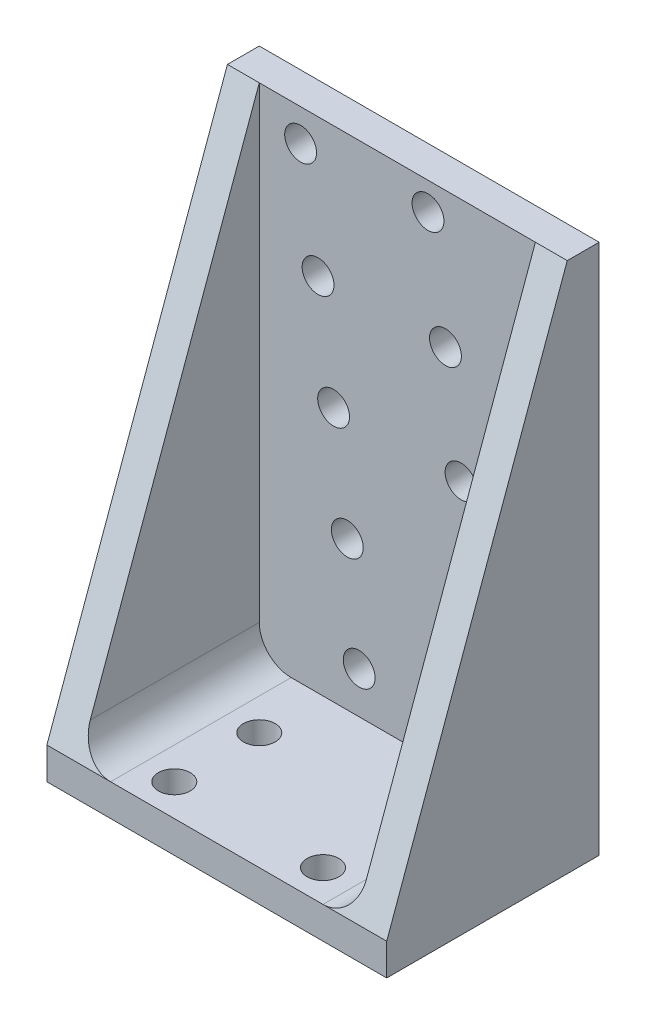
ISO-10303-21;
HEADER;
FILE_DESCRIPTION(('STEP AP214'),'2;1');
FILE_NAME('part.step','',(''),(''),'','','');
FILE_SCHEMA(('AUTOMOTIVE_DESIGN { 1 0 10303 214 1 1 1 1 }'));
ENDSEC;
DATA;
#1=APPLICATION_CONTEXT('core data for automotive mechanical design processes');
#2=APPLICATION_PROTOCOL_DEFINITION('international standard','automotive_design',2000,#1);
#3=PRODUCT_CONTEXT('',#1,'mechanical');
#4=PRODUCT('Part','Part','',(#3));
#5=PRODUCT_RELATED_PRODUCT_CATEGORY('part','',(#4));
#6=PRODUCT_DEFINITION_FORMATION('','',#4);
#7=PRODUCT_DEFINITION_CONTEXT('part definition',#1,'design');
#8=PRODUCT_DEFINITION('design','',#6,#7);
#9=PRODUCT_DEFINITION_SHAPE('','',#8);
#10=(LENGTH_UNIT() NAMED_UNIT(*) SI_UNIT(.MILLI.,.METRE.));
#11=(NAMED_UNIT(*) PLANE_ANGLE_UNIT() SI_UNIT($,.RADIAN.));
#12=(NAMED_UNIT(*) SI_UNIT($,.STERADIAN.) SOLID_ANGLE_UNIT());
#13=UNCERTAINTY_MEASURE_WITH_UNIT(LENGTH_MEASURE(1.E-05),#10,'distance_accuracy_value','');
#14=(GEOMETRIC_REPRESENTATION_CONTEXT(3) GLOBAL_UNCERTAINTY_ASSIGNED_CONTEXT((#13)) GLOBAL_UNIT_ASSIGNED_CONTEXT((#10,
#11,#12)) REPRESENTATION_CONTEXT('',''));
#15=CARTESIAN_POINT('',(0.,0.,0.));
#16=DIRECTION('',(0.,0.,1.));
#17=DIRECTION('',(1.,0.,0.));
#18=AXIS2_PLACEMENT_3D('',#15,#16,#17);
#19=CARTESIAN_POINT('',(0.,0.,3.));
#20=DIRECTION('',(0.,0.,1.));
#21=DIRECTION('',(1.,0.,0.));
#22=AXIS2_PLACEMENT_3D('',#19,#20,#21);
#23=PLANE('',#22);
#24=CARTESIAN_POINT('',(-9.10672553053666,19.9841864417442,3.));
#25=DIRECTION('',(0.,0.,1.));
#26=DIRECTION('',(1.,0.,0.));
#27=AXIS2_PLACEMENT_3D('',#24,#25,#26);
#28=CIRCLE('',#27,1.5);
#29=CARTESIAN_POINT('',(-7.60672553053666,19.9841864417442,3.));
#30=VERTEX_POINT('',#29);
#31=EDGE_CURVE('E208',#30,#30,#28,.T.);
#32=ORIENTED_EDGE('',*,*,#31,.F.);
#33=EDGE_LOOP('',(#32));
#34=FACE_BOUND('',#33,.T.);
#35=CARTESIAN_POINT('',(8.40008487268782,-20.4992297331571,3.));
#36=DIRECTION('',(0.,0.,1.));
#37=DIRECTION('',(-1.,0.,0.));
#38=AXIS2_PLACEMENT_3D('',#35,#36,#37);
#39=CIRCLE('',#38,1.5);
#40=CARTESIAN_POINT('',(6.90008487268781,-20.4992297331571,3.));
#41=VERTEX_POINT('',#40);
#42=EDGE_CURVE('E220',#41,#41,#39,.T.);
#43=ORIENTED_EDGE('',*,*,#42,.F.);
#44=EDGE_LOOP('',(#43));
#45=FACE_BOUND('',#44,.T.);
#46=CARTESIAN_POINT('',(7.28948947019076,-10.2391422548933,3.));
#47=DIRECTION('',(0.,0.,1.));
#48=DIRECTION('',(-1.,0.,0.));
#49=AXIS2_PLACEMENT_3D('',#46,#47,#48);
#50=CIRCLE('',#49,1.5);
#51=CARTESIAN_POINT('',(5.78948947019076,-10.2391422548933,3.));
#52=VERTEX_POINT('',#51);
#53=EDGE_CURVE('E232',#52,#52,#50,.T.);
#54=ORIENTED_EDGE('',*,*,#53,.F.);
#55=EDGE_LOOP('',(#54));
#56=FACE_BOUND('',#55,.T.);
#57=CARTESIAN_POINT('',(-7.46616308877687,10.0056492123557,3.));
#58=DIRECTION('',(0.,0.,1.));
#59=DIRECTION('',(1.,0.,0.));
#60=AXIS2_PLACEMENT_3D('',#57,#58,#59);
#61=CIRCLE('',#60,1.5);
#62=CARTESIAN_POINT('',(-5.96616308877687,10.0056492123557,3.));
#63=VERTEX_POINT('',#62);
#64=EDGE_CURVE('E244',#63,#63,#61,.T.);
#65=ORIENTED_EDGE('',*,*,#64,.F.);
#66=EDGE_LOOP('',(#65));
#67=FACE_BOUND('',#66,.T.);
#68=CARTESIAN_POINT('',(-6.,0.,3.));
#69=DIRECTION('',(0.,0.,1.));
#70=DIRECTION('',(1.,0.,0.));
#71=AXIS2_PLACEMENT_3D('',#68,#69,#70);
#72=CIRCLE('',#71,1.5);
#73=CARTESIAN_POINT('',(-4.5,0.,3.));
#74=VERTEX_POINT('',#73);
#75=EDGE_CURVE('E152',#74,#74,#72,.T.);
#76=ORIENTED_EDGE('',*,*,#75,.F.);
#77=EDGE_LOOP('',(#76));
#78=FACE_BOUND('',#77,.T.);
#79=CARTESIAN_POINT('',(6.,0.,3.));
#80=DIRECTION('',(0.,0.,1.));
#81=DIRECTION('',(-1.,0.,0.));
#82=AXIS2_PLACEMENT_3D('',#79,#80,#81);
#83=CIRCLE('',#82,1.5);
#84=CARTESIAN_POINT('',(4.5,0.,3.));
#85=VERTEX_POINT('',#84);
#86=EDGE_CURVE('E250',#85,#85,#83,.T.);
#87=ORIENTED_EDGE('',*,*,#86,.F.);
#88=EDGE_LOOP('',(#87));
#89=FACE_BOUND('',#88,.T.);
#90=CARTESIAN_POINT('',(-4.70868287168593,-10.0297133776459,3.));
#91=DIRECTION('',(0.,0.,1.));
#92=DIRECTION('',(1.,0.,0.));
#93=AXIS2_PLACEMENT_3D('',#90,#91,#92);
#94=CIRCLE('',#93,1.5);
#95=CARTESIAN_POINT('',(-3.20868287168593,-10.0297133776459,3.));
#96=VERTEX_POINT('',#95);
#97=EDGE_CURVE('E238',#96,#96,#94,.T.);
#98=ORIENTED_EDGE('',*,*,#97,.F.);
#99=EDGE_LOOP('',(#98));
#100=FACE_BOUND('',#99,.T.);
#101=CARTESIAN_POINT('',(-3.59260505154133,-20.0804357727271,3.));
#102=DIRECTION('',(0.,0.,1.));
#103=DIRECTION('',(1.,0.,0.));
#104=AXIS2_PLACEMENT_3D('',#101,#102,#103);
#105=CIRCLE('',#104,1.5);
#106=CARTESIAN_POINT('',(-2.09260505154133,-20.0804357727271,3.));
#107=VERTEX_POINT('',#106);
#108=EDGE_CURVE('E226',#107,#107,#105,.T.);
#109=ORIENTED_EDGE('',*,*,#108,.F.);
#110=EDGE_LOOP('',(#109));
#111=FACE_BOUND('',#110,.T.);
#112=CARTESIAN_POINT('',(4.53200925309991,10.2150780896031,3.));
#113=DIRECTION('',(0.,0.,1.));
#114=DIRECTION('',(-1.,0.,0.));
#115=AXIS2_PLACEMENT_3D('',#112,#113,#114);
#116=CIRCLE('',#115,1.5);
#117=CARTESIAN_POINT('',(3.03200925309991,10.2150780896031,3.));
#118=VERTEX_POINT('',#117);
#119=EDGE_CURVE('E214',#118,#118,#116,.T.);
#120=ORIENTED_EDGE('',*,*,#119,.F.);
#121=EDGE_LOOP('',(#120));
#122=FACE_BOUND('',#121,.T.);
#123=CARTESIAN_POINT('',(2.88596439369254,20.4029804021742,3.));
#124=DIRECTION('',(0.,0.,1.));
#125=DIRECTION('',(-1.,0.,0.));
#126=AXIS2_PLACEMENT_3D('',#123,#124,#125);
#127=CIRCLE('',#126,1.5);
#128=CARTESIAN_POINT('',(1.38596439369254,20.4029804021742,3.));
#129=VERTEX_POINT('',#128);
#130=EDGE_CURVE('E198',#129,#129,#127,.T.);
#131=ORIENTED_EDGE('',*,*,#130,.F.);
#132=EDGE_LOOP('',(#131));
#133=FACE_BOUND('',#132,.T.);
#134=DIRECTION('',(1.,0.,0.));
#135=VECTOR('',#134,1.);
#136=CARTESIAN_POINT('',(0.,-24.,3.));
#137=LINE('',#136,#135);
#138=CARTESIAN_POINT('',(-10.,-24.,3.));
#139=VERTEX_POINT('',#138);
#140=CARTESIAN_POINT('',(10.,-24.,3.));
#141=VERTEX_POINT('',#140);
#142=EDGE_CURVE('E191',#139,#141,#137,.T.);
#143=ORIENTED_EDGE('',*,*,#142,.T.);
#144=CARTESIAN_POINT('',(10.,-21.,3.));
#145=DIRECTION('',(0.,0.,1.));
#146=DIRECTION('',(1.,0.,0.));
#147=AXIS2_PLACEMENT_3D('',#144,#145,#146);
#148=CIRCLE('',#147,3.);
#149=CARTESIAN_POINT('',(13.,-21.,3.));
#150=VERTEX_POINT('',#149);
#151=EDGE_CURVE('E174',#141,#150,#148,.T.);
#152=ORIENTED_EDGE('',*,*,#151,.T.);
#153=DIRECTION('',(0.,1.,0.));
#154=VECTOR('',#153,1.);
#155=CARTESIAN_POINT('',(13.,0.,3.));
#156=LINE('',#155,#154);
#157=CARTESIAN_POINT('',(13.,23.,3.));
#158=VERTEX_POINT('',#157);
#159=EDGE_CURVE('E138',#150,#158,#156,.T.);
#160=ORIENTED_EDGE('',*,*,#159,.T.);
#161=DIRECTION('',(-1.,0.,0.));
#162=VECTOR('',#161,1.);
#163=CARTESIAN_POINT('',(-16.,23.,3.));
#164=LINE('',#163,#162);
#165=CARTESIAN_POINT('',(-13.,23.,3.));
#166=VERTEX_POINT('',#165);
#167=EDGE_CURVE('E130',#158,#166,#164,.T.);
#168=ORIENTED_EDGE('',*,*,#167,.T.);
#169=DIRECTION('',(0.,-1.,0.));
#170=VECTOR('',#169,1.);
#171=CARTESIAN_POINT('',(-13.,0.,3.));
#172=LINE('',#171,#170);
#173=CARTESIAN_POINT('',(-13.,-21.,3.));
#174=VERTEX_POINT('',#173);
#175=EDGE_CURVE('E108',#166,#174,#172,.T.);
#176=ORIENTED_EDGE('',*,*,#175,.T.);
#177=CARTESIAN_POINT('',(-10.,-21.,3.));
#178=DIRECTION('',(0.,0.,1.));
#179=DIRECTION('',(1.,0.,0.));
#180=AXIS2_PLACEMENT_3D('',#177,#178,#179);
#181=CIRCLE('',#180,3.);
#182=EDGE_CURVE('E172',#174,#139,#181,.T.);
#183=ORIENTED_EDGE('',*,*,#182,.T.);
#184=EDGE_LOOP('',(#143,#152,#160,#168,#176,#183));
#185=FACE_BOUND('',#184,.T.);
#186=ADVANCED_FACE('F35',(#34,#45,#56,#67,#78,#89,#100,#111,#122,#133,#185),#23,.T.);
#187=CARTESIAN_POINT('',(0.,-24.,0.));
#188=DIRECTION('',(0.,-1.,0.));
#189=DIRECTION('',(0.,0.,-1.));
#190=AXIS2_PLACEMENT_3D('',#187,#188,#189);
#191=PLANE('',#190);
#192=CARTESIAN_POINT('',(-7.,-24.,9.));
#193=DIRECTION('',(0.,-1.,0.));
#194=DIRECTION('',(0.,0.,1.));
#195=AXIS2_PLACEMENT_3D('',#192,#193,#194);
#196=CIRCLE('',#195,1.5);
#197=CARTESIAN_POINT('',(-7.,-24.,10.5));
#198=VERTEX_POINT('',#197);
#199=EDGE_CURVE('E619',#198,#198,#196,.T.);
#200=ORIENTED_EDGE('',*,*,#199,.T.);
#201=EDGE_LOOP('',(#200));
#202=FACE_BOUND('',#201,.T.);
#203=CARTESIAN_POINT('',(-7.,-24.,17.));
#204=DIRECTION('',(0.,-1.,0.));
#205=DIRECTION('',(0.,0.,1.));
#206=AXIS2_PLACEMENT_3D('',#203,#204,#205);
#207=CIRCLE('',#206,1.5);
#208=CARTESIAN_POINT('',(-7.,-24.,18.5));
#209=VERTEX_POINT('',#208);
#210=EDGE_CURVE('E613',#209,#209,#207,.T.);
#211=ORIENTED_EDGE('',*,*,#210,.T.);
#212=EDGE_LOOP('',(#211));
#213=FACE_BOUND('',#212,.T.);
#214=CARTESIAN_POINT('',(7.,-24.,17.));
#215=DIRECTION('',(0.,-1.,0.));
#216=DIRECTION('',(0.,0.,-1.));
#217=AXIS2_PLACEMENT_3D('',#214,#215,#216);
#218=CIRCLE('',#217,1.5);
#219=CARTESIAN_POINT('',(7.,-24.,15.5));
#220=VERTEX_POINT('',#219);
#221=EDGE_CURVE('E608',#220,#220,#218,.T.);
#222=ORIENTED_EDGE('',*,*,#221,.T.);
#223=EDGE_LOOP('',(#222));
#224=FACE_BOUND('',#223,.T.);
#225=CARTESIAN_POINT('',(7.,-24.,9.));
#226=DIRECTION('',(0.,-1.,0.));
#227=DIRECTION('',(0.,0.,-1.));
#228=AXIS2_PLACEMENT_3D('',#225,#226,#227);
#229=CIRCLE('',#228,1.5);
#230=CARTESIAN_POINT('',(7.,-24.,7.5));
#231=VERTEX_POINT('',#230);
#232=EDGE_CURVE('E601',#231,#231,#229,.T.);
#233=ORIENTED_EDGE('',*,*,#232,.T.);
#234=EDGE_LOOP('',(#233));
#235=FACE_BOUND('',#234,.T.);
#236=DIRECTION('',(-1.,0.,0.));
#237=VECTOR('',#236,1.);
#238=CARTESIAN_POINT('',(-16.,-24.,20.));
#239=LINE('',#238,#237);
#240=CARTESIAN_POINT('',(10.,-24.,20.));
#241=VERTEX_POINT('',#240);
#242=CARTESIAN_POINT('',(-10.,-24.,20.));
#243=VERTEX_POINT('',#242);
#244=EDGE_CURVE('E193',#241,#243,#239,.T.);
#245=ORIENTED_EDGE('',*,*,#244,.F.);
#246=DIRECTION('',(0.,0.,1.));
#247=VECTOR('',#246,1.);
#248=CARTESIAN_POINT('',(10.,-24.,3.));
#249=LINE('',#248,#247);
#250=EDGE_CURVE('E170',#241,#141,#249,.F.);
#251=ORIENTED_EDGE('',*,*,#250,.T.);
#252=ORIENTED_EDGE('',*,*,#142,.F.);
#253=DIRECTION('',(0.,0.,-1.));
#254=VECTOR('',#253,1.);
#255=CARTESIAN_POINT('',(-10.,-24.,20.));
#256=LINE('',#255,#254);
#257=EDGE_CURVE('E167',#139,#243,#256,.F.);
#258=ORIENTED_EDGE('',*,*,#257,.T.);
#259=EDGE_LOOP('',(#245,#251,#252,#258));
#260=FACE_BOUND('',#259,.T.);
#261=ADVANCED_FACE('F190',(#202,#213,#224,#235,#260),#191,.F.);
#262=CARTESIAN_POINT('',(0.,0.,0.));
#263=DIRECTION('',(0.,0.,1.));
#264=DIRECTION('',(1.,0.,0.));
#265=AXIS2_PLACEMENT_3D('',#262,#263,#264);
#266=PLANE('',#265);
#267=DIRECTION('',(0.,-1.,0.));
#268=VECTOR('',#267,1.);
#269=CARTESIAN_POINT('',(-16.,23.,0.));
#270=LINE('',#269,#268);
#271=CARTESIAN_POINT('',(-16.,23.,0.));
#272=VERTEX_POINT('',#271);
#273=CARTESIAN_POINT('',(-16.,-27.,0.));
#274=VERTEX_POINT('',#273);
#275=EDGE_CURVE('E143',#272,#274,#270,.T.);
#276=ORIENTED_EDGE('',*,*,#275,.F.);
#277=DIRECTION('',(-1.,0.,0.));
#278=VECTOR('',#277,1.);
#279=CARTESIAN_POINT('',(-16.,23.,0.));
#280=LINE('',#279,#278);
#281=CARTESIAN_POINT('',(16.,23.,0.));
#282=VERTEX_POINT('',#281);
#283=EDGE_CURVE('E151',#282,#272,#280,.T.);
#284=ORIENTED_EDGE('',*,*,#283,.F.);
#285=DIRECTION('',(0.,1.,0.));
#286=VECTOR('',#285,1.);
#287=CARTESIAN_POINT('',(16.,23.,0.));
#288=LINE('',#287,#286);
#289=CARTESIAN_POINT('',(16.,-27.,0.));
#290=VERTEX_POINT('',#289);
#291=EDGE_CURVE('E149',#290,#282,#288,.T.);
#292=ORIENTED_EDGE('',*,*,#291,.F.);
#293=DIRECTION('',(1.,0.,0.));
#294=VECTOR('',#293,1.);
#295=CARTESIAN_POINT('',(-16.,-27.,0.));
#296=LINE('',#295,#294);
#297=EDGE_CURVE('E140',#274,#290,#296,.T.);
#298=ORIENTED_EDGE('',*,*,#297,.F.);
#299=EDGE_LOOP('',(#276,#284,#292,#298));
#300=FACE_BOUND('',#299,.T.);
#301=CARTESIAN_POINT('',(2.88596439369254,20.4029804021742,0.));
#302=DIRECTION('',(0.,0.,1.));
#303=DIRECTION('',(-1.,0.,0.));
#304=AXIS2_PLACEMENT_3D('',#301,#302,#303);
#305=CIRCLE('',#304,1.5);
#306=CARTESIAN_POINT('',(1.38596439369254,20.4029804021742,0.));
#307=VERTEX_POINT('',#306);
#308=EDGE_CURVE('E194',#307,#307,#305,.T.);
#309=ORIENTED_EDGE('',*,*,#308,.T.);
#310=EDGE_LOOP('',(#309));
#311=FACE_BOUND('',#310,.T.);
#312=CARTESIAN_POINT('',(-9.10672553053666,19.9841864417442,0.));
#313=DIRECTION('',(0.,0.,1.));
#314=DIRECTION('',(1.,0.,0.));
#315=AXIS2_PLACEMENT_3D('',#312,#313,#314);
#316=CIRCLE('',#315,1.5);
#317=CARTESIAN_POINT('',(-7.60672553053666,19.9841864417442,0.));
#318=VERTEX_POINT('',#317);
#319=EDGE_CURVE('E206',#318,#318,#316,.T.);
#320=ORIENTED_EDGE('',*,*,#319,.T.);
#321=EDGE_LOOP('',(#320));
#322=FACE_BOUND('',#321,.T.);
#323=CARTESIAN_POINT('',(4.53200925309991,10.2150780896031,0.));
#324=DIRECTION('',(0.,0.,1.));
#325=DIRECTION('',(-1.,0.,0.));
#326=AXIS2_PLACEMENT_3D('',#323,#324,#325);
#327=CIRCLE('',#326,1.5);
#328=CARTESIAN_POINT('',(3.03200925309991,10.2150780896031,0.));
#329=VERTEX_POINT('',#328);
#330=EDGE_CURVE('E211',#329,#329,#327,.T.);
#331=ORIENTED_EDGE('',*,*,#330,.T.);
#332=EDGE_LOOP('',(#331));
#333=FACE_BOUND('',#332,.T.);
#334=CARTESIAN_POINT('',(8.40008487268782,-20.4992297331571,0.));
#335=DIRECTION('',(0.,0.,1.));
#336=DIRECTION('',(-1.,0.,0.));
#337=AXIS2_PLACEMENT_3D('',#334,#335,#336);
#338=CIRCLE('',#337,1.5);
#339=CARTESIAN_POINT('',(6.90008487268781,-20.4992297331571,0.));
#340=VERTEX_POINT('',#339);
#341=EDGE_CURVE('E217',#340,#340,#338,.T.);
#342=ORIENTED_EDGE('',*,*,#341,.T.);
#343=EDGE_LOOP('',(#342));
#344=FACE_BOUND('',#343,.T.);
#345=CARTESIAN_POINT('',(-3.59260505154133,-20.0804357727271,0.));
#346=DIRECTION('',(0.,0.,1.));
#347=DIRECTION('',(1.,0.,0.));
#348=AXIS2_PLACEMENT_3D('',#345,#346,#347);
#349=CIRCLE('',#348,1.5);
#350=CARTESIAN_POINT('',(-2.09260505154133,-20.0804357727271,0.));
#351=VERTEX_POINT('',#350);
#352=EDGE_CURVE('E223',#351,#351,#349,.T.);
#353=ORIENTED_EDGE('',*,*,#352,.T.);
#354=EDGE_LOOP('',(#353));
#355=FACE_BOUND('',#354,.T.);
#356=CARTESIAN_POINT('',(7.28948947019076,-10.2391422548933,0.));
#357=DIRECTION('',(0.,0.,1.));
#358=DIRECTION('',(-1.,0.,0.));
#359=AXIS2_PLACEMENT_3D('',#356,#357,#358);
#360=CIRCLE('',#359,1.5);
#361=CARTESIAN_POINT('',(5.78948947019076,-10.2391422548933,0.));
#362=VERTEX_POINT('',#361);
#363=EDGE_CURVE('E229',#362,#362,#360,.T.);
#364=ORIENTED_EDGE('',*,*,#363,.T.);
#365=EDGE_LOOP('',(#364));
#366=FACE_BOUND('',#365,.T.);
#367=CARTESIAN_POINT('',(-4.70868287168593,-10.0297133776459,0.));
#368=DIRECTION('',(0.,0.,1.));
#369=DIRECTION('',(1.,0.,0.));
#370=AXIS2_PLACEMENT_3D('',#367,#368,#369);
#371=CIRCLE('',#370,1.5);
#372=CARTESIAN_POINT('',(-3.20868287168593,-10.0297133776459,0.));
#373=VERTEX_POINT('',#372);
#374=EDGE_CURVE('E235',#373,#373,#371,.T.);
#375=ORIENTED_EDGE('',*,*,#374,.T.);
#376=EDGE_LOOP('',(#375));
#377=FACE_BOUND('',#376,.T.);
#378=CARTESIAN_POINT('',(-7.46616308877687,10.0056492123557,0.));
#379=DIRECTION('',(0.,0.,1.));
#380=DIRECTION('',(1.,0.,0.));
#381=AXIS2_PLACEMENT_3D('',#378,#379,#380);
#382=CIRCLE('',#381,1.5);
#383=CARTESIAN_POINT('',(-5.96616308877687,10.0056492123557,0.));
#384=VERTEX_POINT('',#383);
#385=EDGE_CURVE('E241',#384,#384,#382,.T.);
#386=ORIENTED_EDGE('',*,*,#385,.T.);
#387=EDGE_LOOP('',(#386));
#388=FACE_BOUND('',#387,.T.);
#389=CARTESIAN_POINT('',(6.,0.,0.));
#390=DIRECTION('',(0.,0.,1.));
#391=DIRECTION('',(-1.,0.,0.));
#392=AXIS2_PLACEMENT_3D('',#389,#390,#391);
#393=CIRCLE('',#392,1.5);
#394=CARTESIAN_POINT('',(4.5,0.,0.));
#395=VERTEX_POINT('',#394);
#396=EDGE_CURVE('E247',#395,#395,#393,.T.);
#397=ORIENTED_EDGE('',*,*,#396,.T.);
#398=EDGE_LOOP('',(#397));
#399=FACE_BOUND('',#398,.T.);
#400=CARTESIAN_POINT('',(-6.,0.,0.));
#401=DIRECTION('',(0.,0.,1.));
#402=DIRECTION('',(1.,0.,0.));
#403=AXIS2_PLACEMENT_3D('',#400,#401,#402);
#404=CIRCLE('',#403,1.5);
#405=CARTESIAN_POINT('',(-4.5,0.,0.));
#406=VERTEX_POINT('',#405);
#407=EDGE_CURVE('E147',#406,#406,#404,.T.);
#408=ORIENTED_EDGE('',*,*,#407,.T.);
#409=EDGE_LOOP('',(#408));
#410=FACE_BOUND('',#409,.T.);
#411=ADVANCED_FACE('F260',(#300,#311,#322,#333,#344,#355,#366,#377,#388,#399,#410),#266,.F.);
#412=CARTESIAN_POINT('',(16.,23.,3.));
#413=DIRECTION('',(-1.,0.,0.));
#414=DIRECTION('',(0.,-1.,0.));
#415=AXIS2_PLACEMENT_3D('',#412,#413,#414);
#416=PLANE('',#415);
#417=DIRECTION('',(0.,0.,-1.));
#418=VECTOR('',#417,1.);
#419=CARTESIAN_POINT('',(16.,23.,3.));
#420=LINE('',#419,#418);
#421=CARTESIAN_POINT('',(16.,23.,3.));
#422=VERTEX_POINT('',#421);
#423=EDGE_CURVE('E161',#422,#282,#420,.T.);
#424=ORIENTED_EDGE('',*,*,#423,.F.);
#425=DIRECTION('',(0.,-0.940376225750505,0.340136081654438));
#426=VECTOR('',#425,1.);
#427=CARTESIAN_POINT('',(16.,23.,3.));
#428=LINE('',#427,#426);
#429=CARTESIAN_POINT('',(16.,-24.,20.));
#430=VERTEX_POINT('',#429);
#431=EDGE_CURVE('E597',#422,#430,#428,.T.);
#432=ORIENTED_EDGE('',*,*,#431,.T.);
#433=DIRECTION('',(0.,-1.,0.));
#434=VECTOR('',#433,1.);
#435=CARTESIAN_POINT('',(16.,-24.,20.));
#436=LINE('',#435,#434);
#437=CARTESIAN_POINT('',(16.,-27.,20.));
#438=VERTEX_POINT('',#437);
#439=EDGE_CURVE('E201',#430,#438,#436,.T.);
#440=ORIENTED_EDGE('',*,*,#439,.T.);
#441=DIRECTION('',(0.,0.,-1.));
#442=VECTOR('',#441,1.);
#443=CARTESIAN_POINT('',(16.,-27.,3.));
#444=LINE('',#443,#442);
#445=EDGE_CURVE('E142',#438,#290,#444,.T.);
#446=ORIENTED_EDGE('',*,*,#445,.T.);
#447=ORIENTED_EDGE('',*,*,#291,.T.);
#448=EDGE_LOOP('',(#424,#432,#440,#446,#447));
#449=FACE_BOUND('',#448,.T.);
#450=ADVANCED_FACE('F289',(#449),#416,.F.);
#451=CARTESIAN_POINT('',(-16.,23.,3.));
#452=DIRECTION('',(0.,-1.,0.));
#453=DIRECTION('',(0.,0.,-1.));
#454=AXIS2_PLACEMENT_3D('',#451,#452,#453);
#455=PLANE('',#454);
#456=DIRECTION('',(1.,0.,0.));
#457=VECTOR('',#456,1.);
#458=CARTESIAN_POINT('',(-16.,23.,3.));
#459=LINE('',#458,#457);
#460=CARTESIAN_POINT('',(-16.,23.,3.));
#461=VERTEX_POINT('',#460);
#462=EDGE_CURVE('E116',#166,#461,#459,.F.);
#463=ORIENTED_EDGE('',*,*,#462,.F.);
#464=ORIENTED_EDGE('',*,*,#167,.F.);
#465=EDGE_CURVE('E139',#422,#158,#164,.T.);
#466=ORIENTED_EDGE('',*,*,#465,.F.);
#467=ORIENTED_EDGE('',*,*,#423,.T.);
#468=ORIENTED_EDGE('',*,*,#283,.T.);
#469=DIRECTION('',(0.,0.,-1.));
#470=VECTOR('',#469,1.);
#471=CARTESIAN_POINT('',(-16.,23.,3.));
#472=LINE('',#471,#470);
#473=EDGE_CURVE('E133',#461,#272,#472,.T.);
#474=ORIENTED_EDGE('',*,*,#473,.F.);
#475=EDGE_LOOP('',(#463,#464,#466,#467,#468,#474));
#476=FACE_BOUND('',#475,.T.);
#477=ADVANCED_FACE('F129',(#476),#455,.F.);
#478=CARTESIAN_POINT('',(-16.,23.,3.));
#479=DIRECTION('',(1.,0.,0.));
#480=DIRECTION('',(0.,1.,0.));
#481=AXIS2_PLACEMENT_3D('',#478,#479,#480);
#482=PLANE('',#481);
#483=DIRECTION('',(0.,0.,-1.));
#484=VECTOR('',#483,1.);
#485=CARTESIAN_POINT('',(-16.,-27.,3.));
#486=LINE('',#485,#484);
#487=CARTESIAN_POINT('',(-16.,-27.,20.));
#488=VERTEX_POINT('',#487);
#489=EDGE_CURVE('E157',#488,#274,#486,.T.);
#490=ORIENTED_EDGE('',*,*,#489,.F.);
#491=DIRECTION('',(0.,-1.,0.));
#492=VECTOR('',#491,1.);
#493=CARTESIAN_POINT('',(-16.,-24.,20.));
#494=LINE('',#493,#492);
#495=CARTESIAN_POINT('',(-16.,-24.,20.));
#496=VERTEX_POINT('',#495);
#497=EDGE_CURVE('E195',#496,#488,#494,.T.);
#498=ORIENTED_EDGE('',*,*,#497,.F.);
#499=DIRECTION('',(0.,-0.940376225750505,0.340136081654438));
#500=VECTOR('',#499,1.);
#501=CARTESIAN_POINT('',(-16.,23.,3.));
#502=LINE('',#501,#500);
#503=EDGE_CURVE('E117',#461,#496,#502,.T.);
#504=ORIENTED_EDGE('',*,*,#503,.F.);
#505=ORIENTED_EDGE('',*,*,#473,.T.);
#506=ORIENTED_EDGE('',*,*,#275,.T.);
#507=EDGE_LOOP('',(#490,#498,#504,#505,#506));
#508=FACE_BOUND('',#507,.T.);
#509=ADVANCED_FACE('F274',(#508),#482,.F.);
#510=CARTESIAN_POINT('',(-16.,-27.,3.));
#511=DIRECTION('',(0.,1.,0.));
#512=DIRECTION('',(0.,0.,1.));
#513=AXIS2_PLACEMENT_3D('',#510,#511,#512);
#514=PLANE('',#513);
#515=ORIENTED_EDGE('',*,*,#297,.T.);
#516=ORIENTED_EDGE('',*,*,#445,.F.);
#517=DIRECTION('',(-1.,0.,0.));
#518=VECTOR('',#517,1.);
#519=CARTESIAN_POINT('',(-16.,-27.,20.));
#520=LINE('',#519,#518);
#521=EDGE_CURVE('E587',#438,#488,#520,.T.);
#522=ORIENTED_EDGE('',*,*,#521,.T.);
#523=ORIENTED_EDGE('',*,*,#489,.T.);
#524=EDGE_LOOP('',(#515,#516,#522,#523));
#525=FACE_BOUND('',#524,.T.);
#526=CARTESIAN_POINT('',(-7.,-27.,9.));
#527=DIRECTION('',(0.,-1.,0.));
#528=DIRECTION('',(0.,0.,1.));
#529=AXIS2_PLACEMENT_3D('',#526,#527,#528);
#530=CIRCLE('',#529,1.5);
#531=CARTESIAN_POINT('',(-7.,-27.,10.5));
#532=VERTEX_POINT('',#531);
#533=EDGE_CURVE('E622',#532,#532,#530,.T.);
#534=ORIENTED_EDGE('',*,*,#533,.F.);
#535=EDGE_LOOP('',(#534));
#536=FACE_BOUND('',#535,.T.);
#537=CARTESIAN_POINT('',(-7.,-27.,17.));
#538=DIRECTION('',(0.,-1.,0.));
#539=DIRECTION('',(0.,0.,1.));
#540=AXIS2_PLACEMENT_3D('',#537,#538,#539);
#541=CIRCLE('',#540,1.5);
#542=CARTESIAN_POINT('',(-7.,-27.,18.5));
#543=VERTEX_POINT('',#542);
#544=EDGE_CURVE('E616',#543,#543,#541,.T.);
#545=ORIENTED_EDGE('',*,*,#544,.F.);
#546=EDGE_LOOP('',(#545));
#547=FACE_BOUND('',#546,.T.);
#548=CARTESIAN_POINT('',(7.,-27.,17.));
#549=DIRECTION('',(0.,-1.,0.));
#550=DIRECTION('',(0.,0.,-1.));
#551=AXIS2_PLACEMENT_3D('',#548,#549,#550);
#552=CIRCLE('',#551,1.5);
#553=CARTESIAN_POINT('',(7.,-27.,15.5));
#554=VERTEX_POINT('',#553);
#555=EDGE_CURVE('E610',#554,#554,#552,.T.);
#556=ORIENTED_EDGE('',*,*,#555,.F.);
#557=EDGE_LOOP('',(#556));
#558=FACE_BOUND('',#557,.T.);
#559=CARTESIAN_POINT('',(7.,-27.,9.));
#560=DIRECTION('',(0.,-1.,0.));
#561=DIRECTION('',(0.,0.,-1.));
#562=AXIS2_PLACEMENT_3D('',#559,#560,#561);
#563=CIRCLE('',#562,1.5);
#564=CARTESIAN_POINT('',(7.,-27.,7.5));
#565=VERTEX_POINT('',#564);
#566=EDGE_CURVE('E603',#565,#565,#563,.T.);
#567=ORIENTED_EDGE('',*,*,#566,.F.);
#568=EDGE_LOOP('',(#567));
#569=FACE_BOUND('',#568,.T.);
#570=ADVANCED_FACE('F265',(#525,#536,#547,#558,#569),#514,.F.);
#571=CARTESIAN_POINT('',(-6.,0.,3.));
#572=DIRECTION('',(0.,0.,-1.));
#573=DIRECTION('',(-1.,0.,0.));
#574=AXIS2_PLACEMENT_3D('',#571,#572,#573);
#575=CYLINDRICAL_SURFACE('',#574,1.5);
#576=ORIENTED_EDGE('',*,*,#75,.T.);
#577=EDGE_LOOP('',(#576));
#578=FACE_BOUND('',#577,.T.);
#579=ORIENTED_EDGE('',*,*,#407,.F.);
#580=EDGE_LOOP('',(#579));
#581=FACE_BOUND('',#580,.T.);
#582=ADVANCED_FACE('F262',(#578,#581),#575,.F.);
#583=CARTESIAN_POINT('',(6.,0.,3.));
#584=DIRECTION('',(0.,0.,-1.));
#585=DIRECTION('',(-1.,0.,0.));
#586=AXIS2_PLACEMENT_3D('',#583,#584,#585);
#587=CYLINDRICAL_SURFACE('',#586,1.5);
#588=ORIENTED_EDGE('',*,*,#86,.T.);
#589=EDGE_LOOP('',(#588));
#590=FACE_BOUND('',#589,.T.);
#591=ORIENTED_EDGE('',*,*,#396,.F.);
#592=EDGE_LOOP('',(#591));
#593=FACE_BOUND('',#592,.T.);
#594=ADVANCED_FACE('F264',(#590,#593),#587,.F.);
#595=CARTESIAN_POINT('',(-7.46616308877687,10.0056492123557,3.));
#596=DIRECTION('',(0.,0.,-1.));
#597=DIRECTION('',(-1.,0.,0.));
#598=AXIS2_PLACEMENT_3D('',#595,#596,#597);
#599=CYLINDRICAL_SURFACE('',#598,1.5);
#600=ORIENTED_EDGE('',*,*,#64,.T.);
#601=EDGE_LOOP('',(#600));
#602=FACE_BOUND('',#601,.T.);
#603=ORIENTED_EDGE('',*,*,#385,.F.);
#604=EDGE_LOOP('',(#603));
#605=FACE_BOUND('',#604,.T.);
#606=ADVANCED_FACE('F271',(#602,#605),#599,.F.);
#607=CARTESIAN_POINT('',(-4.70868287168593,-10.0297133776459,3.));
#608=DIRECTION('',(0.,0.,-1.));
#609=DIRECTION('',(-1.,0.,0.));
#610=AXIS2_PLACEMENT_3D('',#607,#608,#609);
#611=CYLINDRICAL_SURFACE('',#610,1.5);
#612=ORIENTED_EDGE('',*,*,#97,.T.);
#613=EDGE_LOOP('',(#612));
#614=FACE_BOUND('',#613,.T.);
#615=ORIENTED_EDGE('',*,*,#374,.F.);
#616=EDGE_LOOP('',(#615));
#617=FACE_BOUND('',#616,.T.);
#618=ADVANCED_FACE('F359',(#614,#617),#611,.F.);
#619=CARTESIAN_POINT('',(7.28948947019076,-10.2391422548933,3.));
#620=DIRECTION('',(0.,0.,-1.));
#621=DIRECTION('',(-1.,0.,0.));
#622=AXIS2_PLACEMENT_3D('',#619,#620,#621);
#623=CYLINDRICAL_SURFACE('',#622,1.5);
#624=ORIENTED_EDGE('',*,*,#53,.T.);
#625=EDGE_LOOP('',(#624));
#626=FACE_BOUND('',#625,.T.);
#627=ORIENTED_EDGE('',*,*,#363,.F.);
#628=EDGE_LOOP('',(#627));
#629=FACE_BOUND('',#628,.T.);
#630=ADVANCED_FACE('F355',(#626,#629),#623,.F.);
#631=CARTESIAN_POINT('',(-3.59260505154133,-20.0804357727271,3.));
#632=DIRECTION('',(0.,0.,-1.));
#633=DIRECTION('',(-1.,0.,0.));
#634=AXIS2_PLACEMENT_3D('',#631,#632,#633);
#635=CYLINDRICAL_SURFACE('',#634,1.5);
#636=ORIENTED_EDGE('',*,*,#108,.T.);
#637=EDGE_LOOP('',(#636));
#638=FACE_BOUND('',#637,.T.);
#639=ORIENTED_EDGE('',*,*,#352,.F.);
#640=EDGE_LOOP('',(#639));
#641=FACE_BOUND('',#640,.T.);
#642=ADVANCED_FACE('F351',(#638,#641),#635,.F.);
#643=CARTESIAN_POINT('',(8.40008487268782,-20.4992297331571,3.));
#644=DIRECTION('',(0.,0.,-1.));
#645=DIRECTION('',(-1.,0.,0.));
#646=AXIS2_PLACEMENT_3D('',#643,#644,#645);
#647=CYLINDRICAL_SURFACE('',#646,1.5);
#648=ORIENTED_EDGE('',*,*,#42,.T.);
#649=EDGE_LOOP('',(#648));
#650=FACE_BOUND('',#649,.T.);
#651=ORIENTED_EDGE('',*,*,#341,.F.);
#652=EDGE_LOOP('',(#651));
#653=FACE_BOUND('',#652,.T.);
#654=ADVANCED_FACE('F347',(#650,#653),#647,.F.);
#655=CARTESIAN_POINT('',(4.53200925309991,10.2150780896031,3.));
#656=DIRECTION('',(0.,0.,-1.));
#657=DIRECTION('',(-1.,0.,0.));
#658=AXIS2_PLACEMENT_3D('',#655,#656,#657);
#659=CYLINDRICAL_SURFACE('',#658,1.5);
#660=ORIENTED_EDGE('',*,*,#119,.T.);
#661=EDGE_LOOP('',(#660));
#662=FACE_BOUND('',#661,.T.);
#663=ORIENTED_EDGE('',*,*,#330,.F.);
#664=EDGE_LOOP('',(#663));
#665=FACE_BOUND('',#664,.T.);
#666=ADVANCED_FACE('F343',(#662,#665),#659,.F.);
#667=CARTESIAN_POINT('',(-9.10672553053666,19.9841864417442,3.));
#668=DIRECTION('',(0.,0.,-1.));
#669=DIRECTION('',(-1.,0.,0.));
#670=AXIS2_PLACEMENT_3D('',#667,#668,#669);
#671=CYLINDRICAL_SURFACE('',#670,1.5);
#672=ORIENTED_EDGE('',*,*,#31,.T.);
#673=EDGE_LOOP('',(#672));
#674=FACE_BOUND('',#673,.T.);
#675=ORIENTED_EDGE('',*,*,#319,.F.);
#676=EDGE_LOOP('',(#675));
#677=FACE_BOUND('',#676,.T.);
#678=ADVANCED_FACE('F339',(#674,#677),#671,.F.);
#679=CARTESIAN_POINT('',(2.88596439369254,20.4029804021742,3.));
#680=DIRECTION('',(0.,0.,-1.));
#681=DIRECTION('',(-1.,0.,0.));
#682=AXIS2_PLACEMENT_3D('',#679,#680,#681);
#683=CYLINDRICAL_SURFACE('',#682,1.5);
#684=ORIENTED_EDGE('',*,*,#130,.T.);
#685=EDGE_LOOP('',(#684));
#686=FACE_BOUND('',#685,.T.);
#687=ORIENTED_EDGE('',*,*,#308,.F.);
#688=EDGE_LOOP('',(#687));
#689=FACE_BOUND('',#688,.T.);
#690=ADVANCED_FACE('F336',(#686,#689),#683,.F.);
#691=CARTESIAN_POINT('',(-16.,-24.,20.));
#692=DIRECTION('',(0.,0.,1.));
#693=DIRECTION('',(1.,0.,0.));
#694=AXIS2_PLACEMENT_3D('',#691,#692,#693);
#695=PLANE('',#694);
#696=ORIENTED_EDGE('',*,*,#497,.T.);
#697=ORIENTED_EDGE('',*,*,#521,.F.);
#698=ORIENTED_EDGE('',*,*,#439,.F.);
#699=EDGE_CURVE('E51',#430,#241,#239,.T.);
#700=ORIENTED_EDGE('',*,*,#699,.T.);
#701=ORIENTED_EDGE('',*,*,#244,.T.);
#702=EDGE_CURVE('E588',#243,#496,#239,.T.);
#703=ORIENTED_EDGE('',*,*,#702,.T.);
#704=EDGE_LOOP('',(#696,#697,#698,#700,#701,#703));
#705=FACE_BOUND('',#704,.T.);
#706=ADVANCED_FACE('F331',(#705),#695,.T.);
#707=CARTESIAN_POINT('',(7.,-24.,9.));
#708=DIRECTION('',(0.,-1.,0.));
#709=DIRECTION('',(0.,0.,-1.));
#710=AXIS2_PLACEMENT_3D('',#707,#708,#709);
#711=CYLINDRICAL_SURFACE('',#710,1.5);
#712=ORIENTED_EDGE('',*,*,#232,.F.);
#713=EDGE_LOOP('',(#712));
#714=FACE_BOUND('',#713,.T.);
#715=ORIENTED_EDGE('',*,*,#566,.T.);
#716=EDGE_LOOP('',(#715));
#717=FACE_BOUND('',#716,.T.);
#718=ADVANCED_FACE('F328',(#714,#717),#711,.F.);
#719=CARTESIAN_POINT('',(7.,-24.,17.));
#720=DIRECTION('',(0.,-1.,0.));
#721=DIRECTION('',(0.,0.,-1.));
#722=AXIS2_PLACEMENT_3D('',#719,#720,#721);
#723=CYLINDRICAL_SURFACE('',#722,1.5);
#724=ORIENTED_EDGE('',*,*,#221,.F.);
#725=EDGE_LOOP('',(#724));
#726=FACE_BOUND('',#725,.T.);
#727=ORIENTED_EDGE('',*,*,#555,.T.);
#728=EDGE_LOOP('',(#727));
#729=FACE_BOUND('',#728,.T.);
#730=ADVANCED_FACE('F324',(#726,#729),#723,.F.);
#731=CARTESIAN_POINT('',(-7.,-24.,17.));
#732=DIRECTION('',(0.,-1.,0.));
#733=DIRECTION('',(0.,0.,-1.));
#734=AXIS2_PLACEMENT_3D('',#731,#732,#733);
#735=CYLINDRICAL_SURFACE('',#734,1.5);
#736=ORIENTED_EDGE('',*,*,#210,.F.);
#737=EDGE_LOOP('',(#736));
#738=FACE_BOUND('',#737,.T.);
#739=ORIENTED_EDGE('',*,*,#544,.T.);
#740=EDGE_LOOP('',(#739));
#741=FACE_BOUND('',#740,.T.);
#742=ADVANCED_FACE('F320',(#738,#741),#735,.F.);
#743=CARTESIAN_POINT('',(-7.,-24.,9.));
#744=DIRECTION('',(0.,-1.,0.));
#745=DIRECTION('',(0.,0.,-1.));
#746=AXIS2_PLACEMENT_3D('',#743,#744,#745);
#747=CYLINDRICAL_SURFACE('',#746,1.5);
#748=ORIENTED_EDGE('',*,*,#199,.F.);
#749=EDGE_LOOP('',(#748));
#750=FACE_BOUND('',#749,.T.);
#751=ORIENTED_EDGE('',*,*,#533,.T.);
#752=EDGE_LOOP('',(#751));
#753=FACE_BOUND('',#752,.T.);
#754=ADVANCED_FACE('F317',(#750,#753),#747,.F.);
#755=CARTESIAN_POINT('',(16.,23.,3.));
#756=DIRECTION('',(0.,0.340136081654438,0.940376225750506));
#757=DIRECTION('',(0.,-0.940376225750505,0.340136081654438));
#758=AXIS2_PLACEMENT_3D('',#755,#756,#757);
#759=PLANE('',#758);
#760=ORIENTED_EDGE('',*,*,#431,.F.);
#761=ORIENTED_EDGE('',*,*,#465,.T.);
#762=DIRECTION('',(0.,-0.940376225750505,0.340136081654438));
#763=VECTOR('',#762,1.);
#764=CARTESIAN_POINT('',(13.,23.,3.));
#765=LINE('',#764,#763);
#766=CARTESIAN_POINT('',(13.,-21.,18.9148936170213));
#767=VERTEX_POINT('',#766);
#768=EDGE_CURVE('E134',#158,#767,#765,.T.);
#769=ORIENTED_EDGE('',*,*,#768,.T.);
#770=CARTESIAN_POINT('',(10.,-21.,18.9148936170213));
#771=DIRECTION('',(0.,0.340136081654438,0.940376225750506));
#772=DIRECTION('',(0.,0.940376225750506,-0.340136081654438));
#773=AXIS2_PLACEMENT_3D('',#770,#771,#772);
#774=ELLIPSE('',#773,3.19021251053612,3.);
#775=EDGE_CURVE('E44',#767,#241,#774,.F.);
#776=ORIENTED_EDGE('',*,*,#775,.T.);
#777=ORIENTED_EDGE('',*,*,#699,.F.);
#778=EDGE_LOOP('',(#760,#761,#769,#776,#777));
#779=FACE_BOUND('',#778,.T.);
#780=ADVANCED_FACE('F181',(#779),#759,.T.);
#781=CARTESIAN_POINT('',(13.,-2.,10.));
#782=DIRECTION('',(1.,0.,0.));
#783=DIRECTION('',(0.,1.,0.));
#784=AXIS2_PLACEMENT_3D('',#781,#782,#783);
#785=PLANE('',#784);
#786=ORIENTED_EDGE('',*,*,#159,.F.);
#787=DIRECTION('',(0.,0.,1.));
#788=VECTOR('',#787,1.);
#789=CARTESIAN_POINT('',(13.,-21.,20.));
#790=LINE('',#789,#788);
#791=EDGE_CURVE('E164',#150,#767,#790,.T.);
#792=ORIENTED_EDGE('',*,*,#791,.T.);
#793=ORIENTED_EDGE('',*,*,#768,.F.);
#794=EDGE_LOOP('',(#786,#792,#793));
#795=FACE_BOUND('',#794,.T.);
#796=ADVANCED_FACE('F309',(#795),#785,.F.);
#797=CARTESIAN_POINT('',(-16.,23.,3.));
#798=DIRECTION('',(0.,-0.340136081654438,-0.940376225750506));
#799=DIRECTION('',(0.,-0.940376225750505,0.340136081654438));
#800=AXIS2_PLACEMENT_3D('',#797,#798,#799);
#801=PLANE('',#800);
#802=DIRECTION('',(0.,-0.940376225750505,0.340136081654438));
#803=VECTOR('',#802,1.);
#804=CARTESIAN_POINT('',(-13.,23.,3.));
#805=LINE('',#804,#803);
#806=CARTESIAN_POINT('',(-13.,-21.,18.9148936170213));
#807=VERTEX_POINT('',#806);
#808=EDGE_CURVE('E111',#166,#807,#805,.T.);
#809=ORIENTED_EDGE('',*,*,#808,.F.);
#810=ORIENTED_EDGE('',*,*,#462,.T.);
#811=ORIENTED_EDGE('',*,*,#503,.T.);
#812=ORIENTED_EDGE('',*,*,#702,.F.);
#813=CARTESIAN_POINT('',(-10.,-21.,18.9148936170213));
#814=DIRECTION('',(0.,-0.340136081654438,-0.940376225750506));
#815=DIRECTION('',(0.,-0.940376225750506,0.340136081654438));
#816=AXIS2_PLACEMENT_3D('',#813,#814,#815);
#817=ELLIPSE('',#816,3.19021251053612,3.);
#818=EDGE_CURVE('E11',#243,#807,#817,.T.);
#819=ORIENTED_EDGE('',*,*,#818,.T.);
#820=EDGE_LOOP('',(#809,#810,#811,#812,#819));
#821=FACE_BOUND('',#820,.T.);
#822=ADVANCED_FACE('F121',(#821),#801,.F.);
#823=CARTESIAN_POINT('',(-13.,-2.,10.));
#824=DIRECTION('',(-1.,0.,0.));
#825=DIRECTION('',(0.,-1.,0.));
#826=AXIS2_PLACEMENT_3D('',#823,#824,#825);
#827=PLANE('',#826);
#828=ORIENTED_EDGE('',*,*,#808,.T.);
#829=DIRECTION('',(0.,0.,-1.));
#830=VECTOR('',#829,1.);
#831=CARTESIAN_POINT('',(-13.,-21.,3.));
#832=LINE('',#831,#830);
#833=EDGE_CURVE('E113',#807,#174,#832,.T.);
#834=ORIENTED_EDGE('',*,*,#833,.T.);
#835=ORIENTED_EDGE('',*,*,#175,.F.);
#836=EDGE_LOOP('',(#828,#834,#835));
#837=FACE_BOUND('',#836,.T.);
#838=ADVANCED_FACE('F110',(#837),#827,.F.);
#839=CARTESIAN_POINT('',(10.,-21.,10.));
#840=DIRECTION('',(0.,0.,-1.));
#841=DIRECTION('',(-1.,0.,0.));
#842=AXIS2_PLACEMENT_3D('',#839,#840,#841);
#843=CYLINDRICAL_SURFACE('',#842,3.);
#844=ORIENTED_EDGE('',*,*,#151,.F.);
#845=ORIENTED_EDGE('',*,*,#250,.F.);
#846=ORIENTED_EDGE('',*,*,#775,.F.);
#847=ORIENTED_EDGE('',*,*,#791,.F.);
#848=EDGE_LOOP('',(#844,#845,#846,#847));
#849=FACE_BOUND('',#848,.T.);
#850=ADVANCED_FACE('F187',(#849),#843,.F.);
#851=CARTESIAN_POINT('',(-10.,-21.,10.));
#852=DIRECTION('',(0.,0.,1.));
#853=DIRECTION('',(1.,0.,0.));
#854=AXIS2_PLACEMENT_3D('',#851,#852,#853);
#855=CYLINDRICAL_SURFACE('',#854,3.);
#856=ORIENTED_EDGE('',*,*,#818,.F.);
#857=ORIENTED_EDGE('',*,*,#257,.F.);
#858=ORIENTED_EDGE('',*,*,#182,.F.);
#859=ORIENTED_EDGE('',*,*,#833,.F.);
#860=EDGE_LOOP('',(#856,#857,#858,#859));
#861=FACE_BOUND('',#860,.T.);
#862=ADVANCED_FACE('F37',(#861),#855,.F.);
#863=CLOSED_SHELL('',(#186,#261,#411,#450,#477,#509,#570,#582,#594,#606,#618,#630,#642,#654,
#666,#678,#690,#706,#718,#730,#742,#754,#780,#796,#822,#838,#850,#862));
#864=MANIFOLD_SOLID_BREP('B2',#863);
#865=ADVANCED_BREP_SHAPE_REPRESENTATION('',(#18,#864),#14);
#866=SHAPE_DEFINITION_REPRESENTATION(#9,#865);
ENDSEC;
END-ISO-10303-21;
